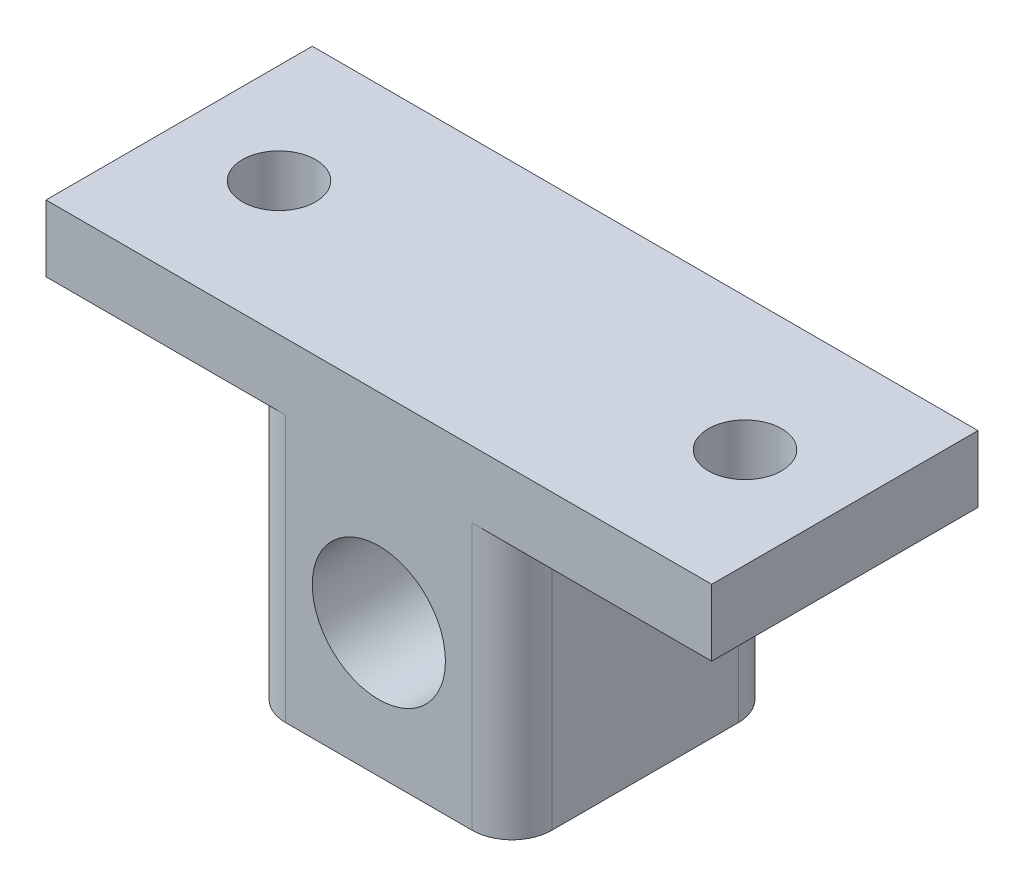
ISO-10303-21;
HEADER;
FILE_DESCRIPTION(('STEP AP214'),'2;1');
FILE_NAME('part.step','',(''),(''),'','','');
FILE_SCHEMA(('AUTOMOTIVE_DESIGN { 1 0 10303 214 1 1 1 1 }'));
ENDSEC;
DATA;
#1=APPLICATION_CONTEXT('core data for automotive mechanical design processes');
#2=APPLICATION_PROTOCOL_DEFINITION('international standard','automotive_design',2000,#1);
#3=PRODUCT_CONTEXT('',#1,'mechanical');
#4=PRODUCT('Part','Part','',(#3));
#5=PRODUCT_RELATED_PRODUCT_CATEGORY('part','',(#4));
#6=PRODUCT_DEFINITION_FORMATION('','',#4);
#7=PRODUCT_DEFINITION_CONTEXT('part definition',#1,'design');
#8=PRODUCT_DEFINITION('design','',#6,#7);
#9=PRODUCT_DEFINITION_SHAPE('','',#8);
#10=(LENGTH_UNIT() NAMED_UNIT(*) SI_UNIT(.MILLI.,.METRE.));
#11=(NAMED_UNIT(*) PLANE_ANGLE_UNIT() SI_UNIT($,.RADIAN.));
#12=(NAMED_UNIT(*) SI_UNIT($,.STERADIAN.) SOLID_ANGLE_UNIT());
#13=UNCERTAINTY_MEASURE_WITH_UNIT(LENGTH_MEASURE(1.E-05),#10,'distance_accuracy_value','');
#14=(GEOMETRIC_REPRESENTATION_CONTEXT(3) GLOBAL_UNCERTAINTY_ASSIGNED_CONTEXT((#13)) GLOBAL_UNIT_ASSIGNED_CONTEXT((#10,
#11,#12)) REPRESENTATION_CONTEXT('',''));
#15=CARTESIAN_POINT('',(0.,0.,0.));
#16=DIRECTION('',(0.,0.,1.));
#17=DIRECTION('',(1.,0.,0.));
#18=AXIS2_PLACEMENT_3D('',#15,#16,#17);
#19=CARTESIAN_POINT('',(-14.4383536595061,0.,20.));
#20=DIRECTION('',(0.,1.,0.));
#21=DIRECTION('',(-1.,0.,0.));
#22=AXIS2_PLACEMENT_3D('',#19,#20,#21);
#23=PLANE('',#22);
#24=DIRECTION('',(0.,0.,-1.));
#25=VECTOR('',#24,1.);
#26=CARTESIAN_POINT('',(-34.4383536595061,0.,20.));
#27=LINE('',#26,#25);
#28=CARTESIAN_POINT('',(-34.4383536595061,0.,17.));
#29=VERTEX_POINT('',#28);
#30=CARTESIAN_POINT('',(-34.4383536595061,0.,3.));
#31=VERTEX_POINT('',#30);
#32=EDGE_CURVE('E154',#29,#31,#27,.T.);
#33=ORIENTED_EDGE('',*,*,#32,.T.);
#34=CARTESIAN_POINT('',(-31.4383536595061,0.,3.));
#35=DIRECTION('',(0.,1.,0.));
#36=DIRECTION('',(-1.,0.,0.));
#37=AXIS2_PLACEMENT_3D('',#34,#35,#36);
#38=CIRCLE('',#37,3.);
#39=CARTESIAN_POINT('',(-31.4383536595061,0.,0.));
#40=VERTEX_POINT('',#39);
#41=EDGE_CURVE('E201',#31,#40,#38,.F.);
#42=ORIENTED_EDGE('',*,*,#41,.T.);
#43=DIRECTION('',(1.,0.,0.));
#44=VECTOR('',#43,1.);
#45=CARTESIAN_POINT('',(-14.4383536595061,0.,0.));
#46=LINE('',#45,#44);
#47=CARTESIAN_POINT('',(-17.4383536595061,0.,0.));
#48=VERTEX_POINT('',#47);
#49=EDGE_CURVE('E155',#40,#48,#46,.T.);
#50=ORIENTED_EDGE('',*,*,#49,.T.);
#51=CARTESIAN_POINT('',(-17.4383536595061,0.,3.));
#52=DIRECTION('',(0.,1.,0.));
#53=DIRECTION('',(-1.,0.,0.));
#54=AXIS2_PLACEMENT_3D('',#51,#52,#53);
#55=CIRCLE('',#54,3.);
#56=CARTESIAN_POINT('',(-14.4383536595061,0.,3.));
#57=VERTEX_POINT('',#56);
#58=EDGE_CURVE('E199',#48,#57,#55,.F.);
#59=ORIENTED_EDGE('',*,*,#58,.T.);
#60=DIRECTION('',(0.,0.,-1.));
#61=VECTOR('',#60,1.);
#62=CARTESIAN_POINT('',(-14.4383536595061,0.,20.));
#63=LINE('',#62,#61);
#64=CARTESIAN_POINT('',(-14.4383536595061,0.,17.));
#65=VERTEX_POINT('',#64);
#66=EDGE_CURVE('E182',#65,#57,#63,.T.);
#67=ORIENTED_EDGE('',*,*,#66,.F.);
#68=CARTESIAN_POINT('',(-17.4383536595061,0.,17.));
#69=DIRECTION('',(0.,1.,0.));
#70=DIRECTION('',(-1.,0.,0.));
#71=AXIS2_PLACEMENT_3D('',#68,#69,#70);
#72=CIRCLE('',#71,3.);
#73=CARTESIAN_POINT('',(-17.4383536595061,0.,20.));
#74=VERTEX_POINT('',#73);
#75=EDGE_CURVE('E195',#65,#74,#72,.F.);
#76=ORIENTED_EDGE('',*,*,#75,.T.);
#77=DIRECTION('',(1.,0.,0.));
#78=VECTOR('',#77,1.);
#79=CARTESIAN_POINT('',(-34.4383536595061,0.,20.));
#80=LINE('',#79,#78);
#81=CARTESIAN_POINT('',(-31.4383536595061,0.,20.));
#82=VERTEX_POINT('',#81);
#83=EDGE_CURVE('E130',#82,#74,#80,.T.);
#84=ORIENTED_EDGE('',*,*,#83,.F.);
#85=CARTESIAN_POINT('',(-31.4383536595061,0.,17.));
#86=DIRECTION('',(0.,1.,0.));
#87=DIRECTION('',(-1.,0.,0.));
#88=AXIS2_PLACEMENT_3D('',#85,#86,#87);
#89=CIRCLE('',#88,3.);
#90=EDGE_CURVE('E197',#82,#29,#89,.F.);
#91=ORIENTED_EDGE('',*,*,#90,.T.);
#92=EDGE_LOOP('',(#33,#42,#50,#59,#67,#76,#84,#91));
#93=FACE_BOUND('',#92,.T.);
#94=ADVANCED_FACE('F36',(#93),#23,.F.);
#95=CARTESIAN_POINT('',(-14.4383536595061,20.,20.));
#96=DIRECTION('',(-1.,0.,0.));
#97=DIRECTION('',(0.,-1.,0.));
#98=AXIS2_PLACEMENT_3D('',#95,#96,#97);
#99=PLANE('',#98);
#100=ORIENTED_EDGE('',*,*,#66,.T.);
#101=DIRECTION('',(0.,1.,0.));
#102=VECTOR('',#101,1.);
#103=CARTESIAN_POINT('',(-14.4383536595061,20.,3.));
#104=LINE('',#103,#102);
#105=CARTESIAN_POINT('',(-14.4383536595061,20.,3.));
#106=VERTEX_POINT('',#105);
#107=EDGE_CURVE('E210',#57,#106,#104,.T.);
#108=ORIENTED_EDGE('',*,*,#107,.T.);
#109=DIRECTION('',(0.,0.,-1.));
#110=VECTOR('',#109,1.);
#111=CARTESIAN_POINT('',(-14.4383536595061,20.,20.));
#112=LINE('',#111,#110);
#113=CARTESIAN_POINT('',(-14.4383536595061,20.,17.));
#114=VERTEX_POINT('',#113);
#115=EDGE_CURVE('E140',#114,#106,#112,.T.);
#116=ORIENTED_EDGE('',*,*,#115,.F.);
#117=DIRECTION('',(0.,1.,0.));
#118=VECTOR('',#117,1.);
#119=CARTESIAN_POINT('',(-14.4383536595061,20.,17.));
#120=LINE('',#119,#118);
#121=EDGE_CURVE('E208',#114,#65,#120,.F.);
#122=ORIENTED_EDGE('',*,*,#121,.T.);
#123=EDGE_LOOP('',(#100,#108,#116,#122));
#124=FACE_BOUND('',#123,.T.);
#125=ADVANCED_FACE('F278',(#124),#99,.F.);
#126=CARTESIAN_POINT('',(0.561646340493883,20.,20.));
#127=DIRECTION('',(0.,1.,0.));
#128=DIRECTION('',(-1.,0.,0.));
#129=AXIS2_PLACEMENT_3D('',#126,#127,#128);
#130=PLANE('',#129);
#131=CARTESIAN_POINT('',(-6.93835365950612,20.,10.));
#132=DIRECTION('',(0.,1.,0.));
#133=DIRECTION('',(-1.,0.,0.));
#134=AXIS2_PLACEMENT_3D('',#131,#132,#133);
#135=CIRCLE('',#134,2.75);
#136=CARTESIAN_POINT('',(-9.68835365950612,20.,10.));
#137=VERTEX_POINT('',#136);
#138=EDGE_CURVE('E189',#137,#137,#135,.T.);
#139=ORIENTED_EDGE('',*,*,#138,.T.);
#140=EDGE_LOOP('',(#139));
#141=FACE_BOUND('',#140,.T.);
#142=DIRECTION('',(1.,0.,0.));
#143=VECTOR('',#142,1.);
#144=CARTESIAN_POINT('',(0.561646340493883,20.,0.));
#145=LINE('',#144,#143);
#146=CARTESIAN_POINT('',(-17.4383536595061,20.,0.));
#147=VERTEX_POINT('',#146);
#148=CARTESIAN_POINT('',(0.561646340493883,20.,0.));
#149=VERTEX_POINT('',#148);
#150=EDGE_CURVE('E136',#147,#149,#145,.T.);
#151=ORIENTED_EDGE('',*,*,#150,.T.);
#152=DIRECTION('',(0.,0.,-1.));
#153=VECTOR('',#152,1.);
#154=CARTESIAN_POINT('',(0.561646340493883,20.,20.));
#155=LINE('',#154,#153);
#156=CARTESIAN_POINT('',(0.561646340493883,20.,20.));
#157=VERTEX_POINT('',#156);
#158=EDGE_CURVE('E133',#157,#149,#155,.T.);
#159=ORIENTED_EDGE('',*,*,#158,.F.);
#160=DIRECTION('',(1.,0.,0.));
#161=VECTOR('',#160,1.);
#162=CARTESIAN_POINT('',(0.561646340493883,20.,20.));
#163=LINE('',#162,#161);
#164=CARTESIAN_POINT('',(-17.4383536595061,20.,20.));
#165=VERTEX_POINT('',#164);
#166=EDGE_CURVE('E58',#165,#157,#163,.T.);
#167=ORIENTED_EDGE('',*,*,#166,.F.);
#168=CARTESIAN_POINT('',(-17.4383536595061,20.,17.));
#169=DIRECTION('',(0.,1.,0.));
#170=DIRECTION('',(-1.,0.,0.));
#171=AXIS2_PLACEMENT_3D('',#168,#169,#170);
#172=CIRCLE('',#171,3.);
#173=EDGE_CURVE('E11',#165,#114,#172,.T.);
#174=ORIENTED_EDGE('',*,*,#173,.T.);
#175=ORIENTED_EDGE('',*,*,#115,.T.);
#176=CARTESIAN_POINT('',(-17.4383536595061,20.,3.));
#177=DIRECTION('',(0.,1.,0.));
#178=DIRECTION('',(-1.,0.,0.));
#179=AXIS2_PLACEMENT_3D('',#176,#177,#178);
#180=CIRCLE('',#179,3.);
#181=EDGE_CURVE('E218',#106,#147,#180,.T.);
#182=ORIENTED_EDGE('',*,*,#181,.T.);
#183=EDGE_LOOP('',(#151,#159,#167,#174,#175,#182));
#184=FACE_BOUND('',#183,.T.);
#185=ADVANCED_FACE('F134',(#141,#184),#130,.F.);
#186=CARTESIAN_POINT('',(0.561646340493882,25.,20.));
#187=DIRECTION('',(-1.,0.,0.));
#188=DIRECTION('',(0.,-1.,0.));
#189=AXIS2_PLACEMENT_3D('',#186,#187,#188);
#190=PLANE('',#189);
#191=DIRECTION('',(0.,1.,0.));
#192=VECTOR('',#191,1.);
#193=CARTESIAN_POINT('',(0.561646340493882,25.,0.));
#194=LINE('',#193,#192);
#195=CARTESIAN_POINT('',(0.561646340493882,25.,0.));
#196=VERTEX_POINT('',#195);
#197=EDGE_CURVE('E160',#149,#196,#194,.T.);
#198=ORIENTED_EDGE('',*,*,#197,.T.);
#199=DIRECTION('',(0.,0.,-1.));
#200=VECTOR('',#199,1.);
#201=CARTESIAN_POINT('',(0.561646340493882,25.,20.));
#202=LINE('',#201,#200);
#203=CARTESIAN_POINT('',(0.561646340493882,25.,20.));
#204=VERTEX_POINT('',#203);
#205=EDGE_CURVE('E141',#204,#196,#202,.T.);
#206=ORIENTED_EDGE('',*,*,#205,.F.);
#207=DIRECTION('',(0.,1.,0.));
#208=VECTOR('',#207,1.);
#209=CARTESIAN_POINT('',(0.561646340493882,25.,20.));
#210=LINE('',#209,#208);
#211=EDGE_CURVE('E125',#157,#204,#210,.T.);
#212=ORIENTED_EDGE('',*,*,#211,.F.);
#213=ORIENTED_EDGE('',*,*,#158,.T.);
#214=EDGE_LOOP('',(#198,#206,#212,#213));
#215=FACE_BOUND('',#214,.T.);
#216=ADVANCED_FACE('F143',(#215),#190,.F.);
#217=CARTESIAN_POINT('',(-49.4383536595061,25.,20.));
#218=DIRECTION('',(0.,-1.,0.));
#219=DIRECTION('',(1.,0.,0.));
#220=AXIS2_PLACEMENT_3D('',#217,#218,#219);
#221=PLANE('',#220);
#222=CARTESIAN_POINT('',(-41.9383536595061,25.,10.));
#223=DIRECTION('',(0.,1.,0.));
#224=DIRECTION('',(-1.,0.,0.));
#225=AXIS2_PLACEMENT_3D('',#222,#223,#224);
#226=CIRCLE('',#225,2.75);
#227=CARTESIAN_POINT('',(-44.6883536595061,25.,10.));
#228=VERTEX_POINT('',#227);
#229=EDGE_CURVE('E190',#228,#228,#226,.T.);
#230=ORIENTED_EDGE('',*,*,#229,.F.);
#231=EDGE_LOOP('',(#230));
#232=FACE_BOUND('',#231,.T.);
#233=CARTESIAN_POINT('',(-6.93835365950612,25.,10.));
#234=DIRECTION('',(0.,1.,0.));
#235=DIRECTION('',(-1.,0.,0.));
#236=AXIS2_PLACEMENT_3D('',#233,#234,#235);
#237=CIRCLE('',#236,2.75);
#238=CARTESIAN_POINT('',(-9.68835365950612,25.,10.));
#239=VERTEX_POINT('',#238);
#240=EDGE_CURVE('E240',#239,#239,#237,.T.);
#241=ORIENTED_EDGE('',*,*,#240,.F.);
#242=EDGE_LOOP('',(#241));
#243=FACE_BOUND('',#242,.T.);
#244=DIRECTION('',(-1.,0.,0.));
#245=VECTOR('',#244,1.);
#246=CARTESIAN_POINT('',(-49.4383536595061,25.,0.));
#247=LINE('',#246,#245);
#248=CARTESIAN_POINT('',(-49.4383536595061,25.,0.));
#249=VERTEX_POINT('',#248);
#250=EDGE_CURVE('E162',#196,#249,#247,.T.);
#251=ORIENTED_EDGE('',*,*,#250,.T.);
#252=DIRECTION('',(0.,0.,-1.));
#253=VECTOR('',#252,1.);
#254=CARTESIAN_POINT('',(-49.4383536595061,25.,20.));
#255=LINE('',#254,#253);
#256=CARTESIAN_POINT('',(-49.4383536595061,25.,20.));
#257=VERTEX_POINT('',#256);
#258=EDGE_CURVE('E176',#257,#249,#255,.T.);
#259=ORIENTED_EDGE('',*,*,#258,.F.);
#260=DIRECTION('',(-1.,0.,0.));
#261=VECTOR('',#260,1.);
#262=CARTESIAN_POINT('',(-24.4383536595061,25.,20.));
#263=LINE('',#262,#261);
#264=EDGE_CURVE('E146',#204,#257,#263,.T.);
#265=ORIENTED_EDGE('',*,*,#264,.F.);
#266=ORIENTED_EDGE('',*,*,#205,.T.);
#267=EDGE_LOOP('',(#251,#259,#265,#266));
#268=FACE_BOUND('',#267,.T.);
#269=ADVANCED_FACE('F249',(#232,#243,#268),#221,.F.);
#270=CARTESIAN_POINT('',(-49.4383536595061,20.,20.));
#271=DIRECTION('',(1.,0.,0.));
#272=DIRECTION('',(0.,0.,-1.));
#273=AXIS2_PLACEMENT_3D('',#270,#271,#272);
#274=PLANE('',#273);
#275=DIRECTION('',(0.,-1.,0.));
#276=VECTOR('',#275,1.);
#277=CARTESIAN_POINT('',(-49.4383536595061,20.,0.));
#278=LINE('',#277,#276);
#279=CARTESIAN_POINT('',(-49.4383536595061,20.,0.));
#280=VERTEX_POINT('',#279);
#281=EDGE_CURVE('E164',#249,#280,#278,.T.);
#282=ORIENTED_EDGE('',*,*,#281,.T.);
#283=DIRECTION('',(0.,0.,-1.));
#284=VECTOR('',#283,1.);
#285=CARTESIAN_POINT('',(-49.4383536595061,20.,20.));
#286=LINE('',#285,#284);
#287=CARTESIAN_POINT('',(-49.4383536595061,20.,20.));
#288=VERTEX_POINT('',#287);
#289=EDGE_CURVE('E173',#288,#280,#286,.T.);
#290=ORIENTED_EDGE('',*,*,#289,.F.);
#291=DIRECTION('',(0.,-1.,0.));
#292=VECTOR('',#291,1.);
#293=CARTESIAN_POINT('',(-49.4383536595061,20.,20.));
#294=LINE('',#293,#292);
#295=EDGE_CURVE('E148',#257,#288,#294,.T.);
#296=ORIENTED_EDGE('',*,*,#295,.F.);
#297=ORIENTED_EDGE('',*,*,#258,.T.);
#298=EDGE_LOOP('',(#282,#290,#296,#297));
#299=FACE_BOUND('',#298,.T.);
#300=ADVANCED_FACE('F252',(#299),#274,.F.);
#301=CARTESIAN_POINT('',(-34.4383536595061,20.,20.));
#302=DIRECTION('',(0.,1.,0.));
#303=DIRECTION('',(-1.,0.,0.));
#304=AXIS2_PLACEMENT_3D('',#301,#302,#303);
#305=PLANE('',#304);
#306=CARTESIAN_POINT('',(-41.9383536595061,20.,10.));
#307=DIRECTION('',(0.,1.,0.));
#308=DIRECTION('',(-1.,0.,0.));
#309=AXIS2_PLACEMENT_3D('',#306,#307,#308);
#310=CIRCLE('',#309,2.75);
#311=CARTESIAN_POINT('',(-44.6883536595061,20.,10.));
#312=VERTEX_POINT('',#311);
#313=EDGE_CURVE('E186',#312,#312,#310,.T.);
#314=ORIENTED_EDGE('',*,*,#313,.T.);
#315=EDGE_LOOP('',(#314));
#316=FACE_BOUND('',#315,.T.);
#317=DIRECTION('',(1.,0.,0.));
#318=VECTOR('',#317,1.);
#319=CARTESIAN_POINT('',(-34.4383536595061,20.,0.));
#320=LINE('',#319,#318);
#321=CARTESIAN_POINT('',(-31.4383536595061,20.,0.));
#322=VERTEX_POINT('',#321);
#323=EDGE_CURVE('E166',#280,#322,#320,.T.);
#324=ORIENTED_EDGE('',*,*,#323,.T.);
#325=CARTESIAN_POINT('',(-31.4383536595061,20.,3.));
#326=DIRECTION('',(0.,1.,0.));
#327=DIRECTION('',(-1.,0.,0.));
#328=AXIS2_PLACEMENT_3D('',#325,#326,#327);
#329=CIRCLE('',#328,3.);
#330=CARTESIAN_POINT('',(-34.4383536595061,20.,3.));
#331=VERTEX_POINT('',#330);
#332=EDGE_CURVE('E216',#322,#331,#329,.T.);
#333=ORIENTED_EDGE('',*,*,#332,.T.);
#334=DIRECTION('',(0.,0.,-1.));
#335=VECTOR('',#334,1.);
#336=CARTESIAN_POINT('',(-34.4383536595061,20.,20.));
#337=LINE('',#336,#335);
#338=CARTESIAN_POINT('',(-34.4383536595061,20.,17.));
#339=VERTEX_POINT('',#338);
#340=EDGE_CURVE('E170',#339,#331,#337,.T.);
#341=ORIENTED_EDGE('',*,*,#340,.F.);
#342=CARTESIAN_POINT('',(-31.4383536595061,20.,17.));
#343=DIRECTION('',(0.,1.,0.));
#344=DIRECTION('',(-1.,0.,0.));
#345=AXIS2_PLACEMENT_3D('',#342,#343,#344);
#346=CIRCLE('',#345,3.);
#347=CARTESIAN_POINT('',(-31.4383536595061,20.,20.));
#348=VERTEX_POINT('',#347);
#349=EDGE_CURVE('E44',#339,#348,#346,.T.);
#350=ORIENTED_EDGE('',*,*,#349,.T.);
#351=DIRECTION('',(1.,0.,0.));
#352=VECTOR('',#351,1.);
#353=CARTESIAN_POINT('',(-34.4383536595061,20.,20.));
#354=LINE('',#353,#352);
#355=EDGE_CURVE('E51',#288,#348,#354,.T.);
#356=ORIENTED_EDGE('',*,*,#355,.F.);
#357=ORIENTED_EDGE('',*,*,#289,.T.);
#358=EDGE_LOOP('',(#324,#333,#341,#350,#356,#357));
#359=FACE_BOUND('',#358,.T.);
#360=ADVANCED_FACE('F223',(#316,#359),#305,.F.);
#361=CARTESIAN_POINT('',(-34.4383536595061,0.,20.));
#362=DIRECTION('',(1.,0.,0.));
#363=DIRECTION('',(0.,0.,-1.));
#364=AXIS2_PLACEMENT_3D('',#361,#362,#363);
#365=PLANE('',#364);
#366=ORIENTED_EDGE('',*,*,#340,.T.);
#367=DIRECTION('',(0.,-1.,0.));
#368=VECTOR('',#367,1.);
#369=CARTESIAN_POINT('',(-34.4383536595061,0.,3.));
#370=LINE('',#369,#368);
#371=EDGE_CURVE('E192',#331,#31,#370,.T.);
#372=ORIENTED_EDGE('',*,*,#371,.T.);
#373=ORIENTED_EDGE('',*,*,#32,.F.);
#374=DIRECTION('',(0.,-1.,0.));
#375=VECTOR('',#374,1.);
#376=CARTESIAN_POINT('',(-34.4383536595061,0.,17.));
#377=LINE('',#376,#375);
#378=EDGE_CURVE('E185',#29,#339,#377,.F.);
#379=ORIENTED_EDGE('',*,*,#378,.T.);
#380=EDGE_LOOP('',(#366,#372,#373,#379));
#381=FACE_BOUND('',#380,.T.);
#382=ADVANCED_FACE('F270',(#381),#365,.F.);
#383=CARTESIAN_POINT('',(0.,0.,20.));
#384=DIRECTION('',(0.,0.,-1.));
#385=DIRECTION('',(-1.,0.,0.));
#386=AXIS2_PLACEMENT_3D('',#383,#384,#385);
#387=PLANE('',#386);
#388=CARTESIAN_POINT('',(-24.4383536595061,10.,20.));
#389=DIRECTION('',(0.,0.,1.));
#390=DIRECTION('',(1.,0.,0.));
#391=AXIS2_PLACEMENT_3D('',#388,#389,#390);
#392=CIRCLE('',#391,5.);
#393=CARTESIAN_POINT('',(-19.4383536595061,10.,20.));
#394=VERTEX_POINT('',#393);
#395=EDGE_CURVE('E233',#394,#394,#392,.T.);
#396=ORIENTED_EDGE('',*,*,#395,.F.);
#397=EDGE_LOOP('',(#396));
#398=FACE_BOUND('',#397,.T.);
#399=ORIENTED_EDGE('',*,*,#355,.T.);
#400=DIRECTION('',(0.,-1.,0.));
#401=VECTOR('',#400,1.);
#402=CARTESIAN_POINT('',(-31.4383536595061,0.,20.));
#403=LINE('',#402,#401);
#404=EDGE_CURVE('E214',#348,#82,#403,.T.);
#405=ORIENTED_EDGE('',*,*,#404,.T.);
#406=ORIENTED_EDGE('',*,*,#83,.T.);
#407=DIRECTION('',(0.,1.,0.));
#408=VECTOR('',#407,1.);
#409=CARTESIAN_POINT('',(-17.4383536595061,0.,20.));
#410=LINE('',#409,#408);
#411=EDGE_CURVE('E129',#74,#165,#410,.T.);
#412=ORIENTED_EDGE('',*,*,#411,.T.);
#413=ORIENTED_EDGE('',*,*,#166,.T.);
#414=ORIENTED_EDGE('',*,*,#211,.T.);
#415=ORIENTED_EDGE('',*,*,#264,.T.);
#416=ORIENTED_EDGE('',*,*,#295,.T.);
#417=EDGE_LOOP('',(#399,#405,#406,#412,#413,#414,#415,#416));
#418=FACE_BOUND('',#417,.T.);
#419=ADVANCED_FACE('F123',(#398,#418),#387,.F.);
#420=CARTESIAN_POINT('',(0.,0.,0.));
#421=DIRECTION('',(0.,0.,-1.));
#422=DIRECTION('',(-1.,0.,0.));
#423=AXIS2_PLACEMENT_3D('',#420,#421,#422);
#424=PLANE('',#423);
#425=CARTESIAN_POINT('',(-24.4383536595061,10.,0.));
#426=DIRECTION('',(0.,0.,1.));
#427=DIRECTION('',(1.,0.,0.));
#428=AXIS2_PLACEMENT_3D('',#425,#426,#427);
#429=CIRCLE('',#428,5.);
#430=CARTESIAN_POINT('',(-19.4383536595061,10.,0.));
#431=VERTEX_POINT('',#430);
#432=EDGE_CURVE('E158',#431,#431,#429,.T.);
#433=ORIENTED_EDGE('',*,*,#432,.T.);
#434=EDGE_LOOP('',(#433));
#435=FACE_BOUND('',#434,.T.);
#436=ORIENTED_EDGE('',*,*,#49,.F.);
#437=DIRECTION('',(0.,-1.,0.));
#438=VECTOR('',#437,1.);
#439=CARTESIAN_POINT('',(-31.4383536595061,20.,0.));
#440=LINE('',#439,#438);
#441=EDGE_CURVE('E205',#40,#322,#440,.F.);
#442=ORIENTED_EDGE('',*,*,#441,.T.);
#443=ORIENTED_EDGE('',*,*,#323,.F.);
#444=ORIENTED_EDGE('',*,*,#281,.F.);
#445=ORIENTED_EDGE('',*,*,#250,.F.);
#446=ORIENTED_EDGE('',*,*,#197,.F.);
#447=ORIENTED_EDGE('',*,*,#150,.F.);
#448=DIRECTION('',(0.,1.,0.));
#449=VECTOR('',#448,1.);
#450=CARTESIAN_POINT('',(-17.4383536595061,0.,0.));
#451=LINE('',#450,#449);
#452=EDGE_CURVE('E203',#147,#48,#451,.F.);
#453=ORIENTED_EDGE('',*,*,#452,.T.);
#454=EDGE_LOOP('',(#436,#442,#443,#444,#445,#446,#447,#453));
#455=FACE_BOUND('',#454,.T.);
#456=ADVANCED_FACE('F264',(#435,#455),#424,.T.);
#457=CARTESIAN_POINT('',(-24.4383536595061,10.,0.));
#458=DIRECTION('',(0.,0.,1.));
#459=DIRECTION('',(1.,0.,0.));
#460=AXIS2_PLACEMENT_3D('',#457,#458,#459);
#461=CYLINDRICAL_SURFACE('',#460,5.);
#462=ORIENTED_EDGE('',*,*,#432,.F.);
#463=EDGE_LOOP('',(#462));
#464=FACE_BOUND('',#463,.T.);
#465=ORIENTED_EDGE('',*,*,#395,.T.);
#466=EDGE_LOOP('',(#465));
#467=FACE_BOUND('',#466,.T.);
#468=ADVANCED_FACE('F335',(#464,#467),#461,.F.);
#469=CARTESIAN_POINT('',(-41.9383536595061,5.,10.));
#470=DIRECTION('',(0.,1.,0.));
#471=DIRECTION('',(-1.,0.,0.));
#472=AXIS2_PLACEMENT_3D('',#469,#470,#471);
#473=CYLINDRICAL_SURFACE('',#472,2.75);
#474=ORIENTED_EDGE('',*,*,#229,.T.);
#475=EDGE_LOOP('',(#474));
#476=FACE_BOUND('',#475,.T.);
#477=ORIENTED_EDGE('',*,*,#313,.F.);
#478=EDGE_LOOP('',(#477));
#479=FACE_BOUND('',#478,.T.);
#480=ADVANCED_FACE('F246',(#476,#479),#473,.F.);
#481=CARTESIAN_POINT('',(-6.93835365950611,5.,10.));
#482=DIRECTION('',(0.,1.,0.));
#483=DIRECTION('',(-1.,0.,0.));
#484=AXIS2_PLACEMENT_3D('',#481,#482,#483);
#485=CYLINDRICAL_SURFACE('',#484,2.75);
#486=ORIENTED_EDGE('',*,*,#240,.T.);
#487=EDGE_LOOP('',(#486));
#488=FACE_BOUND('',#487,.T.);
#489=ORIENTED_EDGE('',*,*,#138,.F.);
#490=EDGE_LOOP('',(#489));
#491=FACE_BOUND('',#490,.T.);
#492=ADVANCED_FACE('F296',(#488,#491),#485,.F.);
#493=CARTESIAN_POINT('',(-31.4383536595061,0.,3.));
#494=DIRECTION('',(0.,1.,0.));
#495=DIRECTION('',(0.,0.,1.));
#496=AXIS2_PLACEMENT_3D('',#493,#494,#495);
#497=CYLINDRICAL_SURFACE('',#496,3.);
#498=ORIENTED_EDGE('',*,*,#332,.F.);
#499=ORIENTED_EDGE('',*,*,#441,.F.);
#500=ORIENTED_EDGE('',*,*,#41,.F.);
#501=ORIENTED_EDGE('',*,*,#371,.F.);
#502=EDGE_LOOP('',(#498,#499,#500,#501));
#503=FACE_BOUND('',#502,.T.);
#504=ADVANCED_FACE('F271',(#503),#497,.T.);
#505=CARTESIAN_POINT('',(-17.4383536595061,20.,3.));
#506=DIRECTION('',(0.,-1.,0.));
#507=DIRECTION('',(1.,0.,0.));
#508=AXIS2_PLACEMENT_3D('',#505,#506,#507);
#509=CYLINDRICAL_SURFACE('',#508,3.);
#510=ORIENTED_EDGE('',*,*,#58,.F.);
#511=ORIENTED_EDGE('',*,*,#452,.F.);
#512=ORIENTED_EDGE('',*,*,#181,.F.);
#513=ORIENTED_EDGE('',*,*,#107,.F.);
#514=EDGE_LOOP('',(#510,#511,#512,#513));
#515=FACE_BOUND('',#514,.T.);
#516=ADVANCED_FACE('F275',(#515),#509,.T.);
#517=CARTESIAN_POINT('',(-31.4383536595061,0.,17.));
#518=DIRECTION('',(0.,-1.,0.));
#519=DIRECTION('',(0.,0.,-1.));
#520=AXIS2_PLACEMENT_3D('',#517,#518,#519);
#521=CYLINDRICAL_SURFACE('',#520,3.);
#522=ORIENTED_EDGE('',*,*,#349,.F.);
#523=ORIENTED_EDGE('',*,*,#378,.F.);
#524=ORIENTED_EDGE('',*,*,#90,.F.);
#525=ORIENTED_EDGE('',*,*,#404,.F.);
#526=EDGE_LOOP('',(#522,#523,#524,#525));
#527=FACE_BOUND('',#526,.T.);
#528=ADVANCED_FACE('F226',(#527),#521,.T.);
#529=CARTESIAN_POINT('',(-17.4383536595061,0.,17.));
#530=DIRECTION('',(0.,1.,0.));
#531=DIRECTION('',(-1.,0.,0.));
#532=AXIS2_PLACEMENT_3D('',#529,#530,#531);
#533=CYLINDRICAL_SURFACE('',#532,3.);
#534=ORIENTED_EDGE('',*,*,#75,.F.);
#535=ORIENTED_EDGE('',*,*,#121,.F.);
#536=ORIENTED_EDGE('',*,*,#173,.F.);
#537=ORIENTED_EDGE('',*,*,#411,.F.);
#538=EDGE_LOOP('',(#534,#535,#536,#537));
#539=FACE_BOUND('',#538,.T.);
#540=ADVANCED_FACE('F38',(#539),#533,.T.);
#541=CLOSED_SHELL('',(#94,#125,#185,#216,#269,#300,#360,#382,#419,#456,#468,#480,#492,#504,#516,
#528,#540));
#542=MANIFOLD_SOLID_BREP('B2',#541);
#543=ADVANCED_BREP_SHAPE_REPRESENTATION('',(#18,#542),#14);
#544=SHAPE_DEFINITION_REPRESENTATION(#9,#543);
ENDSEC;
END-ISO-10303-21;
